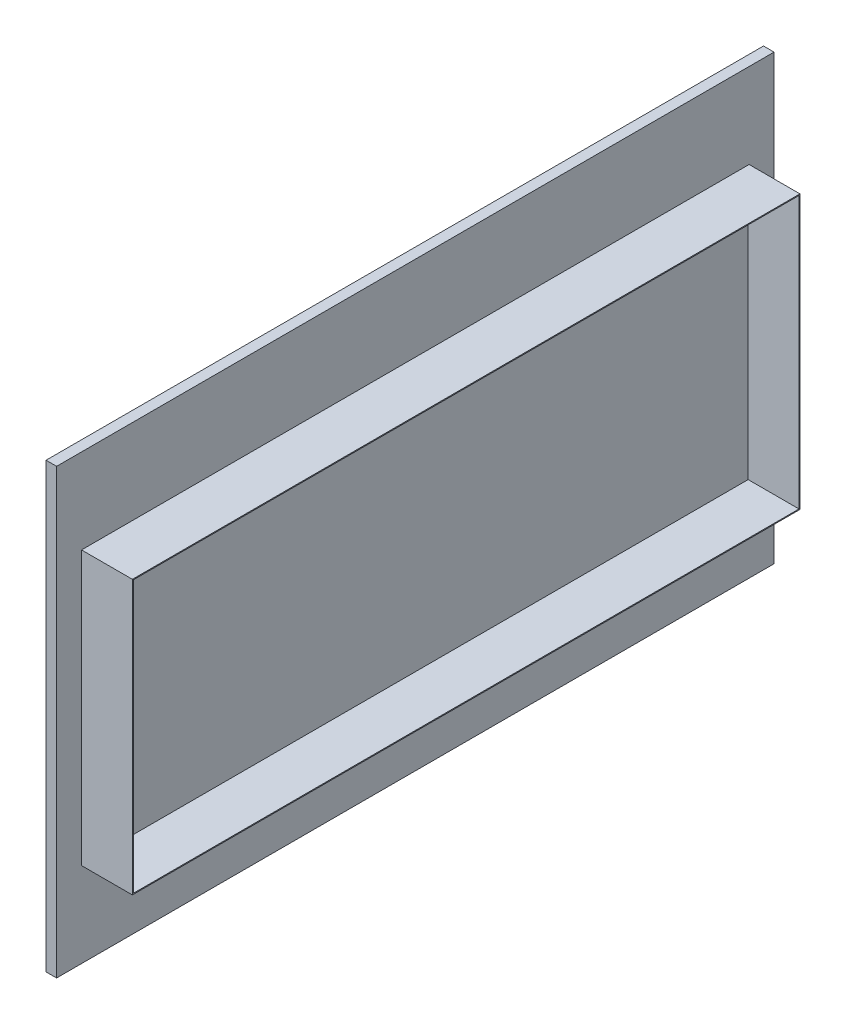
ISO-10303-21;
HEADER;
FILE_DESCRIPTION(('STEP AP214'),'2;1');
FILE_NAME('part.step','',(''),(''),'','','');
FILE_SCHEMA(('AUTOMOTIVE_DESIGN { 1 0 10303 214 1 1 1 1 }'));
ENDSEC;
DATA;
#1=APPLICATION_CONTEXT('core data for automotive mechanical design processes');
#2=APPLICATION_PROTOCOL_DEFINITION('international standard','automotive_design',2000,#1);
#3=PRODUCT_CONTEXT('',#1,'mechanical');
#4=PRODUCT('Part','Part','',(#3));
#5=PRODUCT_RELATED_PRODUCT_CATEGORY('part','',(#4));
#6=PRODUCT_DEFINITION_FORMATION('','',#4);
#7=PRODUCT_DEFINITION_CONTEXT('part definition',#1,'design');
#8=PRODUCT_DEFINITION('design','',#6,#7);
#9=PRODUCT_DEFINITION_SHAPE('','',#8);
#10=(LENGTH_UNIT() NAMED_UNIT(*) SI_UNIT(.MILLI.,.METRE.));
#11=(NAMED_UNIT(*) PLANE_ANGLE_UNIT() SI_UNIT($,.RADIAN.));
#12=(NAMED_UNIT(*) SI_UNIT($,.STERADIAN.) SOLID_ANGLE_UNIT());
#13=UNCERTAINTY_MEASURE_WITH_UNIT(LENGTH_MEASURE(1.E-05),#10,'distance_accuracy_value','');
#14=(GEOMETRIC_REPRESENTATION_CONTEXT(3) GLOBAL_UNCERTAINTY_ASSIGNED_CONTEXT((#13)) GLOBAL_UNIT_ASSIGNED_CONTEXT((#10,
#11,#12)) REPRESENTATION_CONTEXT('',''));
#15=CARTESIAN_POINT('',(0.,0.,0.));
#16=DIRECTION('',(0.,0.,1.));
#17=DIRECTION('',(1.,0.,0.));
#18=AXIS2_PLACEMENT_3D('',#15,#16,#17);
#19=CARTESIAN_POINT('',(2.794,0.,0.));
#20=DIRECTION('',(0.,0.,1.));
#21=DIRECTION('',(0.,-1.,0.));
#22=AXIS2_PLACEMENT_3D('',#19,#20,#21);
#23=PLANE('',#22);
#24=DIRECTION('',(0.,1.,0.));
#25=VECTOR('',#24,1.);
#26=CARTESIAN_POINT('',(0.,0.,0.));
#27=LINE('',#26,#25);
#28=CARTESIAN_POINT('',(0.,-117.348,0.));
#29=VERTEX_POINT('',#28);
#30=CARTESIAN_POINT('',(0.,0.,0.));
#31=VERTEX_POINT('',#30);
#32=EDGE_CURVE('E208',#29,#31,#27,.T.);
#33=ORIENTED_EDGE('',*,*,#32,.T.);
#34=DIRECTION('',(-1.,0.,0.));
#35=VECTOR('',#34,1.);
#36=CARTESIAN_POINT('',(2.794,0.,0.));
#37=LINE('',#36,#35);
#38=CARTESIAN_POINT('',(2.794,0.,0.));
#39=VERTEX_POINT('',#38);
#40=EDGE_CURVE('E12',#39,#31,#37,.T.);
#41=ORIENTED_EDGE('',*,*,#40,.F.);
#42=DIRECTION('',(0.,1.,0.));
#43=VECTOR('',#42,1.);
#44=CARTESIAN_POINT('',(2.794,0.,0.));
#45=LINE('',#44,#43);
#46=CARTESIAN_POINT('',(2.794,-117.348,0.));
#47=VERTEX_POINT('',#46);
#48=EDGE_CURVE('E216',#47,#39,#45,.T.);
#49=ORIENTED_EDGE('',*,*,#48,.F.);
#50=DIRECTION('',(-1.,0.,0.));
#51=VECTOR('',#50,1.);
#52=CARTESIAN_POINT('',(2.794,-117.348,0.));
#53=LINE('',#52,#51);
#54=EDGE_CURVE('E226',#47,#29,#53,.T.);
#55=ORIENTED_EDGE('',*,*,#54,.T.);
#56=EDGE_LOOP('',(#33,#41,#49,#55));
#57=FACE_BOUND('',#56,.T.);
#58=ADVANCED_FACE('F58',(#57),#23,.F.);
#59=CARTESIAN_POINT('',(2.794,0.,0.));
#60=DIRECTION('',(0.,-1.,0.));
#61=DIRECTION('',(0.,0.,-1.));
#62=AXIS2_PLACEMENT_3D('',#59,#60,#61);
#63=PLANE('',#62);
#64=DIRECTION('',(0.,0.,1.));
#65=VECTOR('',#64,1.);
#66=CARTESIAN_POINT('',(0.,0.,0.));
#67=LINE('',#66,#65);
#68=CARTESIAN_POINT('',(0.,0.,189.992));
#69=VERTEX_POINT('',#68);
#70=EDGE_CURVE('E229',#31,#69,#67,.T.);
#71=ORIENTED_EDGE('',*,*,#70,.T.);
#72=DIRECTION('',(-1.,0.,0.));
#73=VECTOR('',#72,1.);
#74=CARTESIAN_POINT('',(2.794,0.,189.992));
#75=LINE('',#74,#73);
#76=CARTESIAN_POINT('',(2.794,0.,189.992));
#77=VERTEX_POINT('',#76);
#78=EDGE_CURVE('E65',#77,#69,#75,.T.);
#79=ORIENTED_EDGE('',*,*,#78,.F.);
#80=DIRECTION('',(0.,0.,1.));
#81=VECTOR('',#80,1.);
#82=CARTESIAN_POINT('',(2.794,0.,0.));
#83=LINE('',#82,#81);
#84=EDGE_CURVE('E219',#39,#77,#83,.T.);
#85=ORIENTED_EDGE('',*,*,#84,.F.);
#86=ORIENTED_EDGE('',*,*,#40,.T.);
#87=EDGE_LOOP('',(#71,#79,#85,#86));
#88=FACE_BOUND('',#87,.T.);
#89=ADVANCED_FACE('F259',(#88),#63,.F.);
#90=CARTESIAN_POINT('',(2.794,0.,189.992));
#91=DIRECTION('',(0.,0.,-1.));
#92=DIRECTION('',(0.,1.,0.));
#93=AXIS2_PLACEMENT_3D('',#90,#91,#92);
#94=PLANE('',#93);
#95=DIRECTION('',(0.,-1.,0.));
#96=VECTOR('',#95,1.);
#97=CARTESIAN_POINT('',(0.,0.,189.992));
#98=LINE('',#97,#96);
#99=CARTESIAN_POINT('',(0.,-117.348,189.992));
#100=VERTEX_POINT('',#99);
#101=EDGE_CURVE('E231',#69,#100,#98,.T.);
#102=ORIENTED_EDGE('',*,*,#101,.T.);
#103=DIRECTION('',(-1.,0.,0.));
#104=VECTOR('',#103,1.);
#105=CARTESIAN_POINT('',(2.794,-117.348,189.992));
#106=LINE('',#105,#104);
#107=CARTESIAN_POINT('',(2.794,-117.348,189.992));
#108=VERTEX_POINT('',#107);
#109=EDGE_CURVE('E236',#108,#100,#106,.T.);
#110=ORIENTED_EDGE('',*,*,#109,.F.);
#111=DIRECTION('',(0.,-1.,0.));
#112=VECTOR('',#111,1.);
#113=CARTESIAN_POINT('',(2.794,0.,189.992));
#114=LINE('',#113,#112);
#115=EDGE_CURVE('E222',#77,#108,#114,.T.);
#116=ORIENTED_EDGE('',*,*,#115,.F.);
#117=ORIENTED_EDGE('',*,*,#78,.T.);
#118=EDGE_LOOP('',(#102,#110,#116,#117));
#119=FACE_BOUND('',#118,.T.);
#120=ADVANCED_FACE('F243',(#119),#94,.F.);
#121=CARTESIAN_POINT('',(2.794,-117.348,0.));
#122=DIRECTION('',(0.,1.,0.));
#123=DIRECTION('',(0.,0.,1.));
#124=AXIS2_PLACEMENT_3D('',#121,#122,#123);
#125=PLANE('',#124);
#126=DIRECTION('',(0.,0.,-1.));
#127=VECTOR('',#126,1.);
#128=CARTESIAN_POINT('',(0.,-117.348,0.));
#129=LINE('',#128,#127);
#130=EDGE_CURVE('E220',#100,#29,#129,.T.);
#131=ORIENTED_EDGE('',*,*,#130,.T.);
#132=ORIENTED_EDGE('',*,*,#54,.F.);
#133=DIRECTION('',(0.,0.,-1.));
#134=VECTOR('',#133,1.);
#135=CARTESIAN_POINT('',(2.794,-117.348,0.));
#136=LINE('',#135,#134);
#137=EDGE_CURVE('E224',#108,#47,#136,.T.);
#138=ORIENTED_EDGE('',*,*,#137,.F.);
#139=ORIENTED_EDGE('',*,*,#109,.T.);
#140=EDGE_LOOP('',(#131,#132,#138,#139));
#141=FACE_BOUND('',#140,.T.);
#142=ADVANCED_FACE('F252',(#141),#125,.F.);
#143=CARTESIAN_POINT('',(2.794,0.,0.));
#144=DIRECTION('',(-1.,0.,0.));
#145=DIRECTION('',(0.,0.,1.));
#146=AXIS2_PLACEMENT_3D('',#143,#144,#145);
#147=PLANE('',#146);
#148=DIRECTION('',(0.,0.,-1.));
#149=VECTOR('',#148,1.);
#150=CARTESIAN_POINT('',(2.794,-22.479,0.));
#151=LINE('',#150,#149);
#152=CARTESIAN_POINT('',(2.794,-22.479,183.388));
#153=VERTEX_POINT('',#152);
#154=CARTESIAN_POINT('',(2.794,-22.479,6.60400000000005));
#155=VERTEX_POINT('',#154);
#156=EDGE_CURVE('E72',#153,#155,#151,.T.);
#157=ORIENTED_EDGE('',*,*,#156,.T.);
#158=DIRECTION('',(0.,-1.,0.));
#159=VECTOR('',#158,1.);
#160=CARTESIAN_POINT('',(2.794,0.,6.60400000000005));
#161=LINE('',#160,#159);
#162=CARTESIAN_POINT('',(2.794,-94.869,6.60400000000005));
#163=VERTEX_POINT('',#162);
#164=EDGE_CURVE('E185',#155,#163,#161,.T.);
#165=ORIENTED_EDGE('',*,*,#164,.T.);
#166=DIRECTION('',(0.,0.,-1.));
#167=VECTOR('',#166,1.);
#168=CARTESIAN_POINT('',(2.794,-94.869,0.));
#169=LINE('',#168,#167);
#170=CARTESIAN_POINT('',(2.794,-94.869,183.388));
#171=VERTEX_POINT('',#170);
#172=EDGE_CURVE('E201',#171,#163,#169,.T.);
#173=ORIENTED_EDGE('',*,*,#172,.F.);
#174=DIRECTION('',(0.,-1.,0.));
#175=VECTOR('',#174,1.);
#176=CARTESIAN_POINT('',(2.794,0.,183.388));
#177=LINE('',#176,#175);
#178=EDGE_CURVE('E77',#153,#171,#177,.T.);
#179=ORIENTED_EDGE('',*,*,#178,.F.);
#180=EDGE_LOOP('',(#157,#165,#173,#179));
#181=FACE_BOUND('',#180,.T.);
#182=ORIENTED_EDGE('',*,*,#48,.T.);
#183=ORIENTED_EDGE('',*,*,#84,.T.);
#184=ORIENTED_EDGE('',*,*,#115,.T.);
#185=ORIENTED_EDGE('',*,*,#137,.T.);
#186=EDGE_LOOP('',(#182,#183,#184,#185));
#187=FACE_BOUND('',#186,.T.);
#188=ADVANCED_FACE('F258',(#181,#187),#147,.F.);
#189=CARTESIAN_POINT('',(0.,0.,0.));
#190=DIRECTION('',(-1.,0.,0.));
#191=DIRECTION('',(0.,0.,1.));
#192=AXIS2_PLACEMENT_3D('',#189,#190,#191);
#193=PLANE('',#192);
#194=ORIENTED_EDGE('',*,*,#32,.F.);
#195=ORIENTED_EDGE('',*,*,#130,.F.);
#196=ORIENTED_EDGE('',*,*,#101,.F.);
#197=ORIENTED_EDGE('',*,*,#70,.F.);
#198=EDGE_LOOP('',(#194,#195,#196,#197));
#199=FACE_BOUND('',#198,.T.);
#200=ADVANCED_FACE('F249',(#199),#193,.T.);
#201=CARTESIAN_POINT('',(16.256,0.,6.60400000000005));
#202=DIRECTION('',(0.,0.,-1.));
#203=DIRECTION('',(-1.,0.,0.));
#204=AXIS2_PLACEMENT_3D('',#201,#202,#203);
#205=PLANE('',#204);
#206=ORIENTED_EDGE('',*,*,#164,.F.);
#207=DIRECTION('',(-1.,0.,0.));
#208=VECTOR('',#207,1.);
#209=CARTESIAN_POINT('',(16.256,-22.479,6.60400000000005));
#210=LINE('',#209,#208);
#211=CARTESIAN_POINT('',(16.256,-22.479,6.60400000000005));
#212=VERTEX_POINT('',#211);
#213=EDGE_CURVE('E206',#212,#155,#210,.T.);
#214=ORIENTED_EDGE('',*,*,#213,.F.);
#215=DIRECTION('',(0.,-1.,0.));
#216=VECTOR('',#215,1.);
#217=CARTESIAN_POINT('',(16.256,0.,6.60400000000005));
#218=LINE('',#217,#216);
#219=CARTESIAN_POINT('',(16.256,-94.869,6.60400000000005));
#220=VERTEX_POINT('',#219);
#221=EDGE_CURVE('E189',#212,#220,#218,.T.);
#222=ORIENTED_EDGE('',*,*,#221,.T.);
#223=DIRECTION('',(-1.,0.,0.));
#224=VECTOR('',#223,1.);
#225=CARTESIAN_POINT('',(16.256,-94.869,6.60400000000005));
#226=LINE('',#225,#224);
#227=EDGE_CURVE('E199',#220,#163,#226,.T.);
#228=ORIENTED_EDGE('',*,*,#227,.T.);
#229=EDGE_LOOP('',(#206,#214,#222,#228));
#230=FACE_BOUND('',#229,.T.);
#231=ADVANCED_FACE('F271',(#230),#205,.T.);
#232=CARTESIAN_POINT('',(16.256,-22.479,0.));
#233=DIRECTION('',(0.,1.,0.));
#234=DIRECTION('',(0.,0.,1.));
#235=AXIS2_PLACEMENT_3D('',#232,#233,#234);
#236=PLANE('',#235);
#237=ORIENTED_EDGE('',*,*,#156,.F.);
#238=DIRECTION('',(-1.,0.,0.));
#239=VECTOR('',#238,1.);
#240=CARTESIAN_POINT('',(16.256,-22.479,183.388));
#241=LINE('',#240,#239);
#242=CARTESIAN_POINT('',(16.256,-22.479,183.388));
#243=VERTEX_POINT('',#242);
#244=EDGE_CURVE('E209',#243,#153,#241,.T.);
#245=ORIENTED_EDGE('',*,*,#244,.F.);
#246=DIRECTION('',(0.,0.,-1.));
#247=VECTOR('',#246,1.);
#248=CARTESIAN_POINT('',(16.256,-22.479,0.));
#249=LINE('',#248,#247);
#250=EDGE_CURVE('E196',#243,#212,#249,.T.);
#251=ORIENTED_EDGE('',*,*,#250,.T.);
#252=ORIENTED_EDGE('',*,*,#213,.T.);
#253=EDGE_LOOP('',(#237,#245,#251,#252));
#254=FACE_BOUND('',#253,.T.);
#255=ADVANCED_FACE('F277',(#254),#236,.T.);
#256=CARTESIAN_POINT('',(16.256,0.,183.388));
#257=DIRECTION('',(0.,0.,-1.));
#258=DIRECTION('',(-1.,0.,0.));
#259=AXIS2_PLACEMENT_3D('',#256,#257,#258);
#260=PLANE('',#259);
#261=ORIENTED_EDGE('',*,*,#178,.T.);
#262=DIRECTION('',(-1.,0.,0.));
#263=VECTOR('',#262,1.);
#264=CARTESIAN_POINT('',(16.256,-94.869,183.388));
#265=LINE('',#264,#263);
#266=CARTESIAN_POINT('',(16.256,-94.869,183.388));
#267=VERTEX_POINT('',#266);
#268=EDGE_CURVE('E211',#267,#171,#265,.T.);
#269=ORIENTED_EDGE('',*,*,#268,.F.);
#270=DIRECTION('',(0.,-1.,0.));
#271=VECTOR('',#270,1.);
#272=CARTESIAN_POINT('',(16.256,0.,183.388));
#273=LINE('',#272,#271);
#274=EDGE_CURVE('E194',#243,#267,#273,.T.);
#275=ORIENTED_EDGE('',*,*,#274,.F.);
#276=ORIENTED_EDGE('',*,*,#244,.T.);
#277=EDGE_LOOP('',(#261,#269,#275,#276));
#278=FACE_BOUND('',#277,.T.);
#279=ADVANCED_FACE('F282',(#278),#260,.F.);
#280=CARTESIAN_POINT('',(16.256,-94.869,0.));
#281=DIRECTION('',(0.,1.,0.));
#282=DIRECTION('',(0.,0.,1.));
#283=AXIS2_PLACEMENT_3D('',#280,#281,#282);
#284=PLANE('',#283);
#285=ORIENTED_EDGE('',*,*,#172,.T.);
#286=ORIENTED_EDGE('',*,*,#227,.F.);
#287=DIRECTION('',(0.,0.,-1.));
#288=VECTOR('',#287,1.);
#289=CARTESIAN_POINT('',(16.256,-94.869,0.));
#290=LINE('',#289,#288);
#291=EDGE_CURVE('E192',#267,#220,#290,.T.);
#292=ORIENTED_EDGE('',*,*,#291,.F.);
#293=ORIENTED_EDGE('',*,*,#268,.T.);
#294=EDGE_LOOP('',(#285,#286,#292,#293));
#295=FACE_BOUND('',#294,.T.);
#296=ADVANCED_FACE('F279',(#295),#284,.F.);
#297=CARTESIAN_POINT('',(16.256,0.,0.));
#298=DIRECTION('',(1.,0.,0.));
#299=DIRECTION('',(0.,0.,-1.));
#300=AXIS2_PLACEMENT_3D('',#297,#298,#299);
#301=PLANE('',#300);
#302=DIRECTION('',(0.,-1.,0.));
#303=VECTOR('',#302,1.);
#304=CARTESIAN_POINT('',(16.256,0.,6.85800000000005));
#305=LINE('',#304,#303);
#306=CARTESIAN_POINT('',(16.256,-22.733,6.85800000000005));
#307=VERTEX_POINT('',#306);
#308=CARTESIAN_POINT('',(16.256,-94.615,6.85800000000005));
#309=VERTEX_POINT('',#308);
#310=EDGE_CURVE('E156',#307,#309,#305,.T.);
#311=ORIENTED_EDGE('',*,*,#310,.T.);
#312=DIRECTION('',(0.,0.,-1.));
#313=VECTOR('',#312,1.);
#314=CARTESIAN_POINT('',(16.256,-94.615,0.));
#315=LINE('',#314,#313);
#316=CARTESIAN_POINT('',(16.256,-94.615,183.134));
#317=VERTEX_POINT('',#316);
#318=EDGE_CURVE('E144',#317,#309,#315,.T.);
#319=ORIENTED_EDGE('',*,*,#318,.F.);
#320=DIRECTION('',(0.,-1.,0.));
#321=VECTOR('',#320,1.);
#322=CARTESIAN_POINT('',(16.256,0.,183.134));
#323=LINE('',#322,#321);
#324=CARTESIAN_POINT('',(16.256,-22.733,183.134));
#325=VERTEX_POINT('',#324);
#326=EDGE_CURVE('E155',#325,#317,#323,.T.);
#327=ORIENTED_EDGE('',*,*,#326,.F.);
#328=DIRECTION('',(0.,0.,-1.));
#329=VECTOR('',#328,1.);
#330=CARTESIAN_POINT('',(16.256,-22.733,0.));
#331=LINE('',#330,#329);
#332=EDGE_CURVE('E165',#325,#307,#331,.T.);
#333=ORIENTED_EDGE('',*,*,#332,.T.);
#334=EDGE_LOOP('',(#311,#319,#327,#333));
#335=FACE_BOUND('',#334,.T.);
#336=ORIENTED_EDGE('',*,*,#221,.F.);
#337=ORIENTED_EDGE('',*,*,#250,.F.);
#338=ORIENTED_EDGE('',*,*,#274,.T.);
#339=ORIENTED_EDGE('',*,*,#291,.T.);
#340=EDGE_LOOP('',(#336,#337,#338,#339));
#341=FACE_BOUND('',#340,.T.);
#342=ADVANCED_FACE('F167',(#335,#341),#301,.T.);
#343=CARTESIAN_POINT('',(16.256,0.,6.85800000000005));
#344=DIRECTION('',(0.,0.,-1.));
#345=DIRECTION('',(-1.,0.,0.));
#346=AXIS2_PLACEMENT_3D('',#343,#344,#345);
#347=PLANE('',#346);
#348=DIRECTION('',(0.,-1.,0.));
#349=VECTOR('',#348,1.);
#350=CARTESIAN_POINT('',(2.794,0.,6.85800000000005));
#351=LINE('',#350,#349);
#352=CARTESIAN_POINT('',(2.794,-22.733,6.85800000000005));
#353=VERTEX_POINT('',#352);
#354=CARTESIAN_POINT('',(2.794,-94.615,6.85800000000005));
#355=VERTEX_POINT('',#354);
#356=EDGE_CURVE('E163',#353,#355,#351,.T.);
#357=ORIENTED_EDGE('',*,*,#356,.T.);
#358=DIRECTION('',(-1.,0.,0.));
#359=VECTOR('',#358,1.);
#360=CARTESIAN_POINT('',(16.256,-94.615,6.85800000000005));
#361=LINE('',#360,#359);
#362=EDGE_CURVE('E148',#309,#355,#361,.T.);
#363=ORIENTED_EDGE('',*,*,#362,.F.);
#364=ORIENTED_EDGE('',*,*,#310,.F.);
#365=DIRECTION('',(-1.,0.,0.));
#366=VECTOR('',#365,1.);
#367=CARTESIAN_POINT('',(16.256,-22.733,6.85800000000005));
#368=LINE('',#367,#366);
#369=EDGE_CURVE('E183',#307,#353,#368,.T.);
#370=ORIENTED_EDGE('',*,*,#369,.T.);
#371=EDGE_LOOP('',(#357,#363,#364,#370));
#372=FACE_BOUND('',#371,.T.);
#373=ADVANCED_FACE('F160',(#372),#347,.F.);
#374=CARTESIAN_POINT('',(16.256,-22.733,0.));
#375=DIRECTION('',(0.,1.,0.));
#376=DIRECTION('',(0.,0.,1.));
#377=AXIS2_PLACEMENT_3D('',#374,#375,#376);
#378=PLANE('',#377);
#379=DIRECTION('',(0.,0.,-1.));
#380=VECTOR('',#379,1.);
#381=CARTESIAN_POINT('',(2.794,-22.733,0.));
#382=LINE('',#381,#380);
#383=CARTESIAN_POINT('',(2.794,-22.733,183.134));
#384=VERTEX_POINT('',#383);
#385=EDGE_CURVE('E170',#384,#353,#382,.T.);
#386=ORIENTED_EDGE('',*,*,#385,.T.);
#387=ORIENTED_EDGE('',*,*,#369,.F.);
#388=ORIENTED_EDGE('',*,*,#332,.F.);
#389=DIRECTION('',(-1.,0.,0.));
#390=VECTOR('',#389,1.);
#391=CARTESIAN_POINT('',(16.256,-22.733,183.134));
#392=LINE('',#391,#390);
#393=EDGE_CURVE('E186',#325,#384,#392,.T.);
#394=ORIENTED_EDGE('',*,*,#393,.T.);
#395=EDGE_LOOP('',(#386,#387,#388,#394));
#396=FACE_BOUND('',#395,.T.);
#397=ADVANCED_FACE('F294',(#396),#378,.F.);
#398=CARTESIAN_POINT('',(16.256,0.,183.134));
#399=DIRECTION('',(0.,0.,-1.));
#400=DIRECTION('',(-1.,0.,0.));
#401=AXIS2_PLACEMENT_3D('',#398,#399,#400);
#402=PLANE('',#401);
#403=DIRECTION('',(0.,-1.,0.));
#404=VECTOR('',#403,1.);
#405=CARTESIAN_POINT('',(2.794,0.,183.134));
#406=LINE('',#405,#404);
#407=CARTESIAN_POINT('',(2.794,-94.615,183.134));
#408=VERTEX_POINT('',#407);
#409=EDGE_CURVE('E173',#384,#408,#406,.T.);
#410=ORIENTED_EDGE('',*,*,#409,.F.);
#411=ORIENTED_EDGE('',*,*,#393,.F.);
#412=ORIENTED_EDGE('',*,*,#326,.T.);
#413=DIRECTION('',(-1.,0.,0.));
#414=VECTOR('',#413,1.);
#415=CARTESIAN_POINT('',(16.256,-94.615,183.134));
#416=LINE('',#415,#414);
#417=EDGE_CURVE('E150',#317,#408,#416,.T.);
#418=ORIENTED_EDGE('',*,*,#417,.T.);
#419=EDGE_LOOP('',(#410,#411,#412,#418));
#420=FACE_BOUND('',#419,.T.);
#421=ADVANCED_FACE('F297',(#420),#402,.T.);
#422=CARTESIAN_POINT('',(16.256,-94.615,0.));
#423=DIRECTION('',(0.,1.,0.));
#424=DIRECTION('',(0.,0.,1.));
#425=AXIS2_PLACEMENT_3D('',#422,#423,#424);
#426=PLANE('',#425);
#427=DIRECTION('',(0.,0.,-1.));
#428=VECTOR('',#427,1.);
#429=CARTESIAN_POINT('',(2.794,-94.615,0.));
#430=LINE('',#429,#428);
#431=EDGE_CURVE('E179',#408,#355,#430,.T.);
#432=ORIENTED_EDGE('',*,*,#431,.F.);
#433=ORIENTED_EDGE('',*,*,#417,.F.);
#434=ORIENTED_EDGE('',*,*,#318,.T.);
#435=ORIENTED_EDGE('',*,*,#362,.T.);
#436=EDGE_LOOP('',(#432,#433,#434,#435));
#437=FACE_BOUND('',#436,.T.);
#438=ADVANCED_FACE('F147',(#437),#426,.T.);
#439=ORIENTED_EDGE('',*,*,#356,.F.);
#440=ORIENTED_EDGE('',*,*,#385,.F.);
#441=ORIENTED_EDGE('',*,*,#409,.T.);
#442=ORIENTED_EDGE('',*,*,#431,.T.);
#443=EDGE_LOOP('',(#439,#440,#441,#442));
#444=FACE_BOUND('',#443,.T.);
#445=ADVANCED_FACE('F274',(#444),#147,.F.);
#446=CLOSED_SHELL('',(#58,#89,#120,#142,#188,#200,#231,#255,#279,#296,#342,#373,#397,#421,#438,#445));
#447=MANIFOLD_SOLID_BREP('B2',#446);
#448=ADVANCED_BREP_SHAPE_REPRESENTATION('',(#18,#447),#14);
#449=SHAPE_DEFINITION_REPRESENTATION(#9,#448);
ENDSEC;
END-ISO-10303-21;
